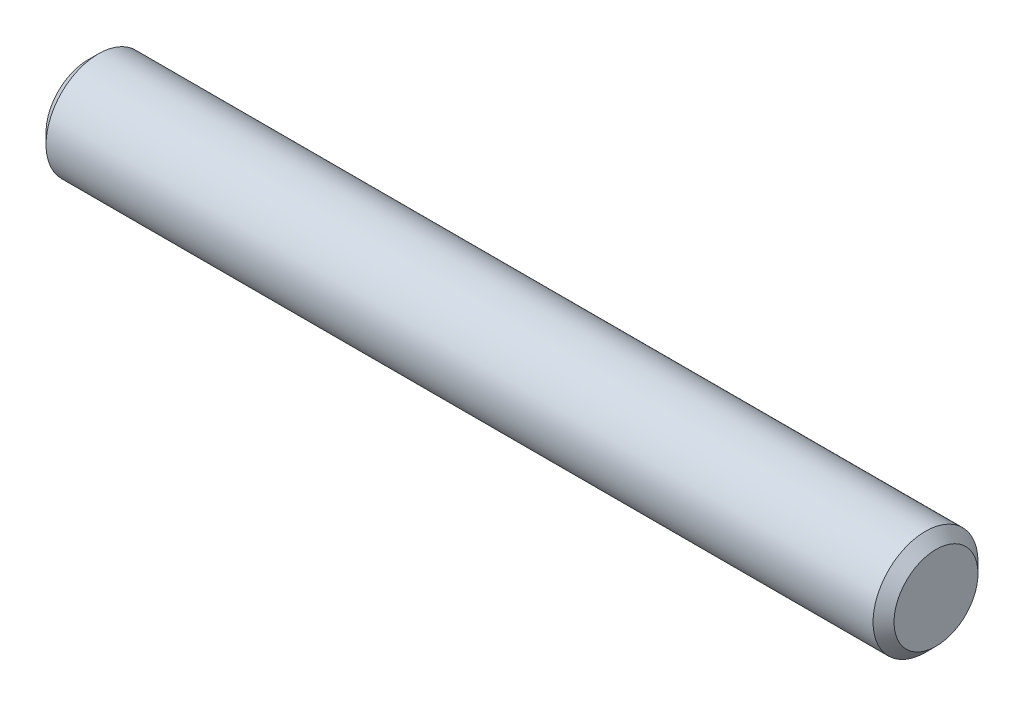
ISO-10303-21;
HEADER;
FILE_DESCRIPTION(('STEP AP214'),'2;1');
FILE_NAME('part.step','',(''),(''),'','','');
FILE_SCHEMA(('AUTOMOTIVE_DESIGN { 1 0 10303 214 1 1 1 1 }'));
ENDSEC;
DATA;
#1=APPLICATION_CONTEXT('core data for automotive mechanical design processes');
#2=APPLICATION_PROTOCOL_DEFINITION('international standard','automotive_design',2000,#1);
#3=PRODUCT_CONTEXT('',#1,'mechanical');
#4=PRODUCT('Part','Part','',(#3));
#5=PRODUCT_RELATED_PRODUCT_CATEGORY('part','',(#4));
#6=PRODUCT_DEFINITION_FORMATION('','',#4);
#7=PRODUCT_DEFINITION_CONTEXT('part definition',#1,'design');
#8=PRODUCT_DEFINITION('design','',#6,#7);
#9=PRODUCT_DEFINITION_SHAPE('','',#8);
#10=(LENGTH_UNIT() NAMED_UNIT(*) SI_UNIT(.MILLI.,.METRE.));
#11=(NAMED_UNIT(*) PLANE_ANGLE_UNIT() SI_UNIT($,.RADIAN.));
#12=(NAMED_UNIT(*) SI_UNIT($,.STERADIAN.) SOLID_ANGLE_UNIT());
#13=UNCERTAINTY_MEASURE_WITH_UNIT(LENGTH_MEASURE(1.E-05),#10,'distance_accuracy_value','');
#14=(GEOMETRIC_REPRESENTATION_CONTEXT(3) GLOBAL_UNCERTAINTY_ASSIGNED_CONTEXT((#13)) GLOBAL_UNIT_ASSIGNED_CONTEXT((#10,
#11,#12)) REPRESENTATION_CONTEXT('',''));
#15=CARTESIAN_POINT('',(0.,0.,0.));
#16=DIRECTION('',(0.,0.,1.));
#17=DIRECTION('',(1.,0.,0.));
#18=AXIS2_PLACEMENT_3D('',#15,#16,#17);
#19=CARTESIAN_POINT('',(80.8,0.,0.));
#20=DIRECTION('',(-1.,0.,0.));
#21=DIRECTION('',(0.,0.,1.));
#22=AXIS2_PLACEMENT_3D('',#19,#20,#21);
#23=CYLINDRICAL_SURFACE('',#22,5.);
#24=CARTESIAN_POINT('',(79.8,0.,0.));
#25=DIRECTION('',(1.,0.,0.));
#26=DIRECTION('',(0.,0.,-1.));
#27=AXIS2_PLACEMENT_3D('',#24,#25,#26);
#28=CIRCLE('',#27,5.);
#29=CARTESIAN_POINT('',(79.8,0.,-5.));
#30=VERTEX_POINT('',#29);
#31=EDGE_CURVE('E47',#30,#30,#28,.F.);
#32=ORIENTED_EDGE('',*,*,#31,.T.);
#33=EDGE_LOOP('',(#32));
#34=FACE_BOUND('',#33,.T.);
#35=CARTESIAN_POINT('',(0.999999999999987,0.,0.));
#36=DIRECTION('',(1.,0.,0.));
#37=DIRECTION('',(0.,0.,-1.));
#38=AXIS2_PLACEMENT_3D('',#35,#36,#37);
#39=CIRCLE('',#38,5.);
#40=CARTESIAN_POINT('',(0.999999999999987,0.,-5.));
#41=VERTEX_POINT('',#40);
#42=EDGE_CURVE('E51',#41,#41,#39,.T.);
#43=ORIENTED_EDGE('',*,*,#42,.T.);
#44=EDGE_LOOP('',(#43));
#45=FACE_BOUND('',#44,.T.);
#46=ADVANCED_FACE('F39',(#34,#45),#23,.T.);
#47=CARTESIAN_POINT('',(80.8,0.,0.));
#48=DIRECTION('',(1.,0.,0.));
#49=DIRECTION('',(0.,0.,-1.));
#50=AXIS2_PLACEMENT_3D('',#47,#48,#49);
#51=PLANE('',#50);
#52=CARTESIAN_POINT('',(80.8,0.,0.));
#53=DIRECTION('',(1.,0.,0.));
#54=DIRECTION('',(0.,0.,-1.));
#55=AXIS2_PLACEMENT_3D('',#52,#53,#54);
#56=CIRCLE('',#55,4.);
#57=CARTESIAN_POINT('',(80.8,0.,-4.));
#58=VERTEX_POINT('',#57);
#59=EDGE_CURVE('E55',#58,#58,#56,.T.);
#60=ORIENTED_EDGE('',*,*,#59,.T.);
#61=EDGE_LOOP('',(#60));
#62=FACE_BOUND('',#61,.T.);
#63=ADVANCED_FACE('F61',(#62),#51,.T.);
#64=CARTESIAN_POINT('',(0.,0.,0.));
#65=DIRECTION('',(1.,0.,0.));
#66=DIRECTION('',(0.,0.,-1.));
#67=AXIS2_PLACEMENT_3D('',#64,#65,#66);
#68=PLANE('',#67);
#69=CARTESIAN_POINT('',(0.,0.,0.));
#70=DIRECTION('',(1.,0.,0.));
#71=DIRECTION('',(0.,0.,-1.));
#72=AXIS2_PLACEMENT_3D('',#69,#70,#71);
#73=CIRCLE('',#72,4.);
#74=CARTESIAN_POINT('',(0.,0.,-4.));
#75=VERTEX_POINT('',#74);
#76=EDGE_CURVE('E10',#75,#75,#73,.F.);
#77=ORIENTED_EDGE('',*,*,#76,.T.);
#78=EDGE_LOOP('',(#77));
#79=FACE_BOUND('',#78,.T.);
#80=ADVANCED_FACE('F65',(#79),#68,.F.);
#81=CARTESIAN_POINT('',(80.8,0.,0.));
#82=DIRECTION('',(-1.,0.,0.));
#83=DIRECTION('',(0.,0.,1.));
#84=AXIS2_PLACEMENT_3D('',#81,#82,#83);
#85=CONICAL_SURFACE('',#84,4.,0.785398163397446);
#86=ORIENTED_EDGE('',*,*,#31,.F.);
#87=EDGE_LOOP('',(#86));
#88=FACE_BOUND('',#87,.T.);
#89=ORIENTED_EDGE('',*,*,#59,.F.);
#90=EDGE_LOOP('',(#89));
#91=FACE_BOUND('',#90,.T.);
#92=ADVANCED_FACE('F63',(#88,#91),#85,.T.);
#93=CARTESIAN_POINT('',(0.999999999999987,0.,0.));
#94=DIRECTION('',(1.,0.,0.));
#95=DIRECTION('',(0.,0.,-1.));
#96=AXIS2_PLACEMENT_3D('',#93,#94,#95);
#97=CONICAL_SURFACE('',#96,5.,0.785398163397456);
#98=ORIENTED_EDGE('',*,*,#76,.F.);
#99=EDGE_LOOP('',(#98));
#100=FACE_BOUND('',#99,.T.);
#101=ORIENTED_EDGE('',*,*,#42,.F.);
#102=EDGE_LOOP('',(#101));
#103=FACE_BOUND('',#102,.T.);
#104=ADVANCED_FACE('F42',(#100,#103),#97,.T.);
#105=CLOSED_SHELL('',(#46,#63,#80,#92,#104));
#106=MANIFOLD_SOLID_BREP('B2',#105);
#107=ADVANCED_BREP_SHAPE_REPRESENTATION('',(#18,#106),#14);
#108=SHAPE_DEFINITION_REPRESENTATION(#9,#107);
ENDSEC;
END-ISO-10303-21;
